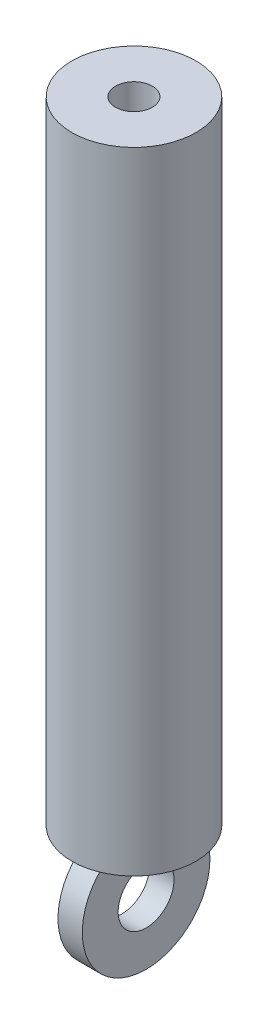
ISO-10303-21;
HEADER;
FILE_DESCRIPTION(('STEP AP214'),'2;1');
FILE_NAME('part.step','',(''),(''),'','','');
FILE_SCHEMA(('AUTOMOTIVE_DESIGN { 1 0 10303 214 1 1 1 1 }'));
ENDSEC;
DATA;
#1=APPLICATION_CONTEXT('core data for automotive mechanical design processes');
#2=APPLICATION_PROTOCOL_DEFINITION('international standard','automotive_design',2000,#1);
#3=PRODUCT_CONTEXT('',#1,'mechanical');
#4=PRODUCT('Part','Part','',(#3));
#5=PRODUCT_RELATED_PRODUCT_CATEGORY('part','',(#4));
#6=PRODUCT_DEFINITION_FORMATION('','',#4);
#7=PRODUCT_DEFINITION_CONTEXT('part definition',#1,'design');
#8=PRODUCT_DEFINITION('design','',#6,#7);
#9=PRODUCT_DEFINITION_SHAPE('','',#8);
#10=(LENGTH_UNIT() NAMED_UNIT(*) SI_UNIT(.MILLI.,.METRE.));
#11=(NAMED_UNIT(*) PLANE_ANGLE_UNIT() SI_UNIT($,.RADIAN.));
#12=(NAMED_UNIT(*) SI_UNIT($,.STERADIAN.) SOLID_ANGLE_UNIT());
#13=UNCERTAINTY_MEASURE_WITH_UNIT(LENGTH_MEASURE(1.E-05),#10,'distance_accuracy_value','');
#14=(GEOMETRIC_REPRESENTATION_CONTEXT(3) GLOBAL_UNCERTAINTY_ASSIGNED_CONTEXT((#13)) GLOBAL_UNIT_ASSIGNED_CONTEXT((#10,
#11,#12)) REPRESENTATION_CONTEXT('',''));
#15=CARTESIAN_POINT('',(0.,0.,0.));
#16=DIRECTION('',(0.,0.,1.));
#17=DIRECTION('',(1.,0.,0.));
#18=AXIS2_PLACEMENT_3D('',#15,#16,#17);
#19=CARTESIAN_POINT('',(0.889,-13.3858,0.));
#20=DIRECTION('',(1.,0.,0.));
#21=DIRECTION('',(0.,0.,-1.));
#22=AXIS2_PLACEMENT_3D('',#19,#20,#21);
#23=PLANE('',#22);
#24=CARTESIAN_POINT('',(0.889,-13.3858,0.));
#25=DIRECTION('',(1.,0.,0.));
#26=DIRECTION('',(0.,0.,-1.));
#27=AXIS2_PLACEMENT_3D('',#24,#25,#26);
#28=CIRCLE('',#27,4.6736);
#29=CARTESIAN_POINT('',(0.889,-13.3858,-4.6736));
#30=VERTEX_POINT('',#29);
#31=EDGE_CURVE('E11',#30,#30,#28,.T.);
#32=ORIENTED_EDGE('',*,*,#31,.T.);
#33=EDGE_LOOP('',(#32));
#34=FACE_BOUND('',#33,.T.);
#35=CARTESIAN_POINT('',(0.889,-13.3858,0.));
#36=DIRECTION('',(1.,0.,0.));
#37=DIRECTION('',(0.,0.,-1.));
#38=AXIS2_PLACEMENT_3D('',#35,#36,#37);
#39=CIRCLE('',#38,2.0447);
#40=CARTESIAN_POINT('',(0.889,-13.3858,-2.0447));
#41=VERTEX_POINT('',#40);
#42=EDGE_CURVE('E52',#41,#41,#39,.T.);
#43=ORIENTED_EDGE('',*,*,#42,.F.);
#44=EDGE_LOOP('',(#43));
#45=FACE_BOUND('',#44,.T.);
#46=ADVANCED_FACE('F41',(#34,#45),#23,.T.);
#47=CARTESIAN_POINT('',(-0.889,-13.3858,0.));
#48=DIRECTION('',(1.,0.,0.));
#49=DIRECTION('',(0.,0.,-1.));
#50=AXIS2_PLACEMENT_3D('',#47,#48,#49);
#51=PLANE('',#50);
#52=CARTESIAN_POINT('',(-0.889,-13.3858,0.));
#53=DIRECTION('',(1.,0.,0.));
#54=DIRECTION('',(0.,0.,-1.));
#55=AXIS2_PLACEMENT_3D('',#52,#53,#54);
#56=CIRCLE('',#55,4.6736);
#57=CARTESIAN_POINT('',(-0.889,-13.3858,-4.6736));
#58=VERTEX_POINT('',#57);
#59=EDGE_CURVE('E45',#58,#58,#56,.T.);
#60=ORIENTED_EDGE('',*,*,#59,.F.);
#61=EDGE_LOOP('',(#60));
#62=FACE_BOUND('',#61,.T.);
#63=CARTESIAN_POINT('',(-0.889,-13.3858,0.));
#64=DIRECTION('',(1.,0.,0.));
#65=DIRECTION('',(0.,0.,-1.));
#66=AXIS2_PLACEMENT_3D('',#63,#64,#65);
#67=CIRCLE('',#66,2.0447);
#68=CARTESIAN_POINT('',(-0.889,-13.3858,-2.0447));
#69=VERTEX_POINT('',#68);
#70=EDGE_CURVE('E54',#69,#69,#67,.T.);
#71=ORIENTED_EDGE('',*,*,#70,.T.);
#72=EDGE_LOOP('',(#71));
#73=FACE_BOUND('',#72,.T.);
#74=ADVANCED_FACE('F64',(#62,#73),#51,.F.);
#75=CARTESIAN_POINT('',(0.889,-13.3858,0.));
#76=DIRECTION('',(-1.,0.,0.));
#77=DIRECTION('',(0.,0.,1.));
#78=AXIS2_PLACEMENT_3D('',#75,#76,#77);
#79=CYLINDRICAL_SURFACE('',#78,4.6736);
#80=ORIENTED_EDGE('',*,*,#31,.F.);
#81=EDGE_LOOP('',(#80));
#82=FACE_BOUND('',#81,.T.);
#83=ORIENTED_EDGE('',*,*,#59,.T.);
#84=EDGE_LOOP('',(#83));
#85=FACE_BOUND('',#84,.T.);
#86=ADVANCED_FACE('F43',(#82,#85),#79,.T.);
#87=CARTESIAN_POINT('',(0.889,-13.3858,0.));
#88=DIRECTION('',(-1.,0.,0.));
#89=DIRECTION('',(0.,0.,1.));
#90=AXIS2_PLACEMENT_3D('',#87,#88,#89);
#91=CYLINDRICAL_SURFACE('',#90,2.0447);
#92=ORIENTED_EDGE('',*,*,#42,.T.);
#93=EDGE_LOOP('',(#92));
#94=FACE_BOUND('',#93,.T.);
#95=ORIENTED_EDGE('',*,*,#70,.F.);
#96=EDGE_LOOP('',(#95));
#97=FACE_BOUND('',#96,.T.);
#98=ADVANCED_FACE('F60',(#94,#97),#91,.F.);
#99=CLOSED_SHELL('',(#46,#74,#86,#98));
#100=MANIFOLD_SOLID_BREP('B2',#99);
#101=CARTESIAN_POINT('',(0.,-9.37131079317638,0.));
#102=DIRECTION('',(0.,1.,0.));
#103=DIRECTION('',(0.,0.,1.));
#104=AXIS2_PLACEMENT_3D('',#101,#102,#103);
#105=CYLINDRICAL_SURFACE('',#104,4.5466);
#106=CARTESIAN_POINT('',(0.,-9.37131079317638,0.));
#107=DIRECTION('',(0.,1.,0.));
#108=DIRECTION('',(0.,0.,1.));
#109=AXIS2_PLACEMENT_3D('',#106,#107,#108);
#110=CIRCLE('',#109,4.5466);
#111=CARTESIAN_POINT('',(0.,-9.37131079317638,4.5466));
#112=VERTEX_POINT('',#111);
#113=EDGE_CURVE('E40',#112,#112,#110,.T.);
#114=ORIENTED_EDGE('',*,*,#113,.T.);
#115=EDGE_LOOP('',(#114));
#116=FACE_BOUND('',#115,.T.);
#117=CARTESIAN_POINT('',(0.,36.83,0.));
#118=DIRECTION('',(0.,1.,0.));
#119=DIRECTION('',(0.,0.,1.));
#120=AXIS2_PLACEMENT_3D('',#117,#118,#119);
#121=CIRCLE('',#120,4.5466);
#122=CARTESIAN_POINT('',(0.,36.83,4.5466));
#123=VERTEX_POINT('',#122);
#124=EDGE_CURVE('E113',#123,#123,#121,.T.);
#125=ORIENTED_EDGE('',*,*,#124,.F.);
#126=EDGE_LOOP('',(#125));
#127=FACE_BOUND('',#126,.T.);
#128=ADVANCED_FACE('F103',(#116,#127),#105,.T.);
#129=CARTESIAN_POINT('',(0.,-9.37131079317638,0.));
#130=DIRECTION('',(0.,1.,0.));
#131=DIRECTION('',(0.,0.,1.));
#132=AXIS2_PLACEMENT_3D('',#129,#130,#131);
#133=PLANE('',#132);
#134=CARTESIAN_POINT('',(0.,-9.37131079317638,0.));
#135=DIRECTION('',(0.,1.,0.));
#136=DIRECTION('',(0.,0.,1.));
#137=AXIS2_PLACEMENT_3D('',#134,#135,#136);
#138=CIRCLE('',#137,1.3462);
#139=CARTESIAN_POINT('',(0.,-9.37131079317638,1.3462));
#140=VERTEX_POINT('',#139);
#141=EDGE_CURVE('E109',#140,#140,#138,.T.);
#142=ORIENTED_EDGE('',*,*,#141,.T.);
#143=EDGE_LOOP('',(#142));
#144=FACE_BOUND('',#143,.T.);
#145=ORIENTED_EDGE('',*,*,#113,.F.);
#146=EDGE_LOOP('',(#145));
#147=FACE_BOUND('',#146,.T.);
#148=ADVANCED_FACE('F132',(#144,#147),#133,.F.);
#149=CARTESIAN_POINT('',(0.,-9.37131079317638,0.));
#150=DIRECTION('',(0.,1.,0.));
#151=DIRECTION('',(0.,0.,1.));
#152=AXIS2_PLACEMENT_3D('',#149,#150,#151);
#153=CYLINDRICAL_SURFACE('',#152,1.3462);
#154=ORIENTED_EDGE('',*,*,#141,.F.);
#155=EDGE_LOOP('',(#154));
#156=FACE_BOUND('',#155,.T.);
#157=CARTESIAN_POINT('',(0.,36.83,0.));
#158=DIRECTION('',(0.,1.,0.));
#159=DIRECTION('',(0.,0.,1.));
#160=AXIS2_PLACEMENT_3D('',#157,#158,#159);
#161=CIRCLE('',#160,1.3462);
#162=CARTESIAN_POINT('',(0.,36.83,1.3462));
#163=VERTEX_POINT('',#162);
#164=EDGE_CURVE('E117',#163,#163,#161,.T.);
#165=ORIENTED_EDGE('',*,*,#164,.T.);
#166=EDGE_LOOP('',(#165));
#167=FACE_BOUND('',#166,.T.);
#168=ADVANCED_FACE('F123',(#156,#167),#153,.F.);
#169=CARTESIAN_POINT('',(0.,36.83,0.));
#170=DIRECTION('',(0.,1.,0.));
#171=DIRECTION('',(0.,0.,1.));
#172=AXIS2_PLACEMENT_3D('',#169,#170,#171);
#173=PLANE('',#172);
#174=ORIENTED_EDGE('',*,*,#124,.T.);
#175=EDGE_LOOP('',(#174));
#176=FACE_BOUND('',#175,.T.);
#177=ORIENTED_EDGE('',*,*,#164,.F.);
#178=EDGE_LOOP('',(#177));
#179=FACE_BOUND('',#178,.T.);
#180=ADVANCED_FACE('F125',(#176,#179),#173,.T.);
#181=CLOSED_SHELL('',(#128,#148,#168,#180));
#182=MANIFOLD_SOLID_BREP('B6',#181);
#183=ADVANCED_BREP_SHAPE_REPRESENTATION('',(#18,#100,#182),#14);
#184=SHAPE_DEFINITION_REPRESENTATION(#9,#183);
ENDSEC;
END-ISO-10303-21;
